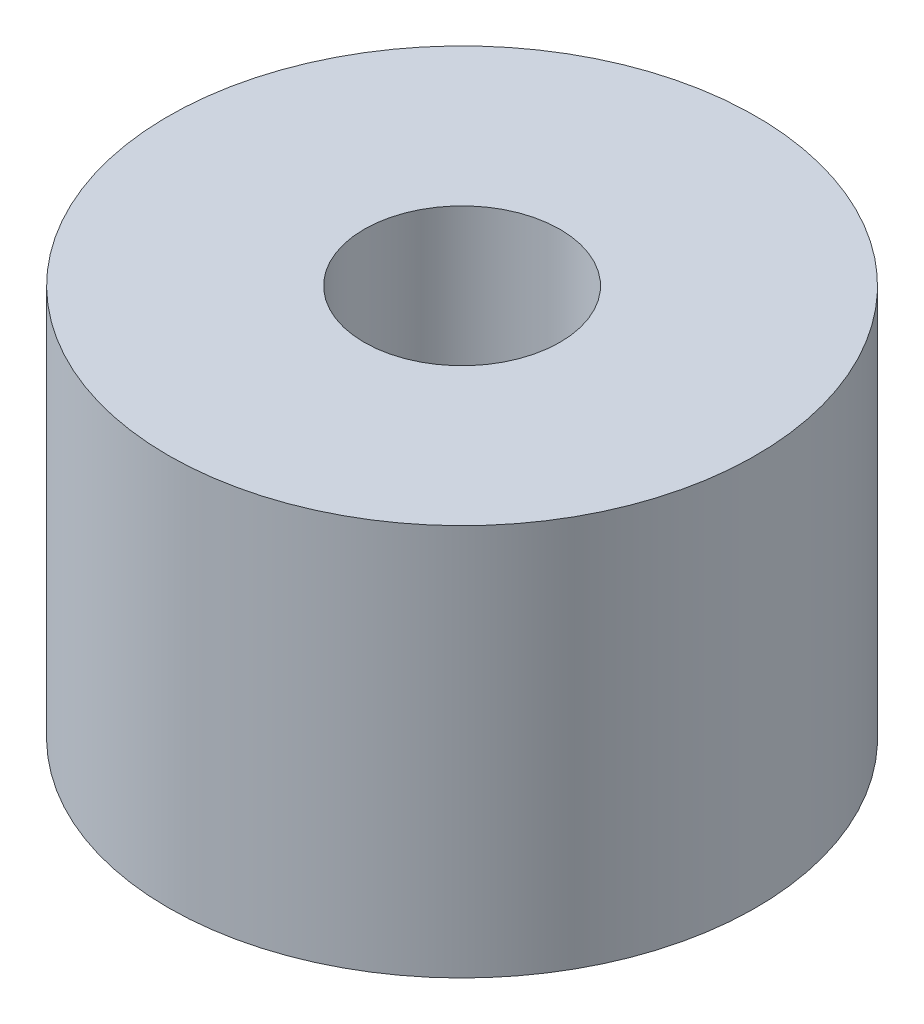
ISO-10303-21;
HEADER;
FILE_DESCRIPTION(('STEP AP214'),'2;1');
FILE_NAME('part.step','',(''),(''),'','','');
FILE_SCHEMA(('AUTOMOTIVE_DESIGN { 1 0 10303 214 1 1 1 1 }'));
ENDSEC;
DATA;
#1=APPLICATION_CONTEXT('core data for automotive mechanical design processes');
#2=APPLICATION_PROTOCOL_DEFINITION('international standard','automotive_design',2000,#1);
#3=PRODUCT_CONTEXT('',#1,'mechanical');
#4=PRODUCT('Part','Part','',(#3));
#5=PRODUCT_RELATED_PRODUCT_CATEGORY('part','',(#4));
#6=PRODUCT_DEFINITION_FORMATION('','',#4);
#7=PRODUCT_DEFINITION_CONTEXT('part definition',#1,'design');
#8=PRODUCT_DEFINITION('design','',#6,#7);
#9=PRODUCT_DEFINITION_SHAPE('','',#8);
#10=(LENGTH_UNIT() NAMED_UNIT(*) SI_UNIT(.MILLI.,.METRE.));
#11=(NAMED_UNIT(*) PLANE_ANGLE_UNIT() SI_UNIT($,.RADIAN.));
#12=(NAMED_UNIT(*) SI_UNIT($,.STERADIAN.) SOLID_ANGLE_UNIT());
#13=UNCERTAINTY_MEASURE_WITH_UNIT(LENGTH_MEASURE(1.E-05),#10,'distance_accuracy_value','');
#14=(GEOMETRIC_REPRESENTATION_CONTEXT(3) GLOBAL_UNCERTAINTY_ASSIGNED_CONTEXT((#13)) GLOBAL_UNIT_ASSIGNED_CONTEXT((#10,
#11,#12)) REPRESENTATION_CONTEXT('',''));
#15=CARTESIAN_POINT('',(0.,0.,0.));
#16=DIRECTION('',(0.,0.,1.));
#17=DIRECTION('',(1.,0.,0.));
#18=AXIS2_PLACEMENT_3D('',#15,#16,#17);
#19=CARTESIAN_POINT('',(0.,5.,0.));
#20=DIRECTION('',(0.,1.,0.));
#21=DIRECTION('',(0.,0.,1.));
#22=AXIS2_PLACEMENT_3D('',#19,#20,#21);
#23=PLANE('',#22);
#24=CARTESIAN_POINT('',(0.,5.,0.));
#25=DIRECTION('',(0.,1.,0.));
#26=DIRECTION('',(0.,0.,1.));
#27=AXIS2_PLACEMENT_3D('',#24,#25,#26);
#28=CIRCLE('',#27,3.75);
#29=CARTESIAN_POINT('',(0.,5.,3.75));
#30=VERTEX_POINT('',#29);
#31=EDGE_CURVE('E10',#30,#30,#28,.T.);
#32=ORIENTED_EDGE('',*,*,#31,.T.);
#33=EDGE_LOOP('',(#32));
#34=FACE_BOUND('',#33,.T.);
#35=CARTESIAN_POINT('',(0.,5.,0.));
#36=DIRECTION('',(0.,1.,0.));
#37=DIRECTION('',(0.,0.,1.));
#38=AXIS2_PLACEMENT_3D('',#35,#36,#37);
#39=CIRCLE('',#38,1.25);
#40=CARTESIAN_POINT('',(0.,5.,1.25));
#41=VERTEX_POINT('',#40);
#42=EDGE_CURVE('E46',#41,#41,#39,.T.);
#43=ORIENTED_EDGE('',*,*,#42,.F.);
#44=EDGE_LOOP('',(#43));
#45=FACE_BOUND('',#44,.T.);
#46=ADVANCED_FACE('F35',(#34,#45),#23,.T.);
#47=CARTESIAN_POINT('',(0.,0.,0.));
#48=DIRECTION('',(0.,1.,0.));
#49=DIRECTION('',(0.,0.,1.));
#50=AXIS2_PLACEMENT_3D('',#47,#48,#49);
#51=PLANE('',#50);
#52=CARTESIAN_POINT('',(0.,0.,0.));
#53=DIRECTION('',(0.,1.,0.));
#54=DIRECTION('',(0.,0.,1.));
#55=AXIS2_PLACEMENT_3D('',#52,#53,#54);
#56=CIRCLE('',#55,3.75);
#57=CARTESIAN_POINT('',(0.,0.,3.75));
#58=VERTEX_POINT('',#57);
#59=EDGE_CURVE('E39',#58,#58,#56,.T.);
#60=ORIENTED_EDGE('',*,*,#59,.F.);
#61=EDGE_LOOP('',(#60));
#62=FACE_BOUND('',#61,.T.);
#63=CARTESIAN_POINT('',(0.,0.,0.));
#64=DIRECTION('',(0.,1.,0.));
#65=DIRECTION('',(0.,0.,1.));
#66=AXIS2_PLACEMENT_3D('',#63,#64,#65);
#67=CIRCLE('',#66,1.25);
#68=CARTESIAN_POINT('',(0.,0.,1.25));
#69=VERTEX_POINT('',#68);
#70=EDGE_CURVE('E48',#69,#69,#67,.T.);
#71=ORIENTED_EDGE('',*,*,#70,.T.);
#72=EDGE_LOOP('',(#71));
#73=FACE_BOUND('',#72,.T.);
#74=ADVANCED_FACE('F58',(#62,#73),#51,.F.);
#75=CARTESIAN_POINT('',(0.,5.,0.));
#76=DIRECTION('',(0.,-1.,0.));
#77=DIRECTION('',(0.,0.,-1.));
#78=AXIS2_PLACEMENT_3D('',#75,#76,#77);
#79=CYLINDRICAL_SURFACE('',#78,3.75);
#80=ORIENTED_EDGE('',*,*,#31,.F.);
#81=EDGE_LOOP('',(#80));
#82=FACE_BOUND('',#81,.T.);
#83=ORIENTED_EDGE('',*,*,#59,.T.);
#84=EDGE_LOOP('',(#83));
#85=FACE_BOUND('',#84,.T.);
#86=ADVANCED_FACE('F37',(#82,#85),#79,.T.);
#87=CARTESIAN_POINT('',(0.,5.,0.));
#88=DIRECTION('',(0.,-1.,0.));
#89=DIRECTION('',(0.,0.,-1.));
#90=AXIS2_PLACEMENT_3D('',#87,#88,#89);
#91=CYLINDRICAL_SURFACE('',#90,1.25);
#92=ORIENTED_EDGE('',*,*,#42,.T.);
#93=EDGE_LOOP('',(#92));
#94=FACE_BOUND('',#93,.T.);
#95=ORIENTED_EDGE('',*,*,#70,.F.);
#96=EDGE_LOOP('',(#95));
#97=FACE_BOUND('',#96,.T.);
#98=ADVANCED_FACE('F54',(#94,#97),#91,.F.);
#99=CLOSED_SHELL('',(#46,#74,#86,#98));
#100=MANIFOLD_SOLID_BREP('B2',#99);
#101=ADVANCED_BREP_SHAPE_REPRESENTATION('',(#18,#100),#14);
#102=SHAPE_DEFINITION_REPRESENTATION(#9,#101);
ENDSEC;
END-ISO-10303-21;
